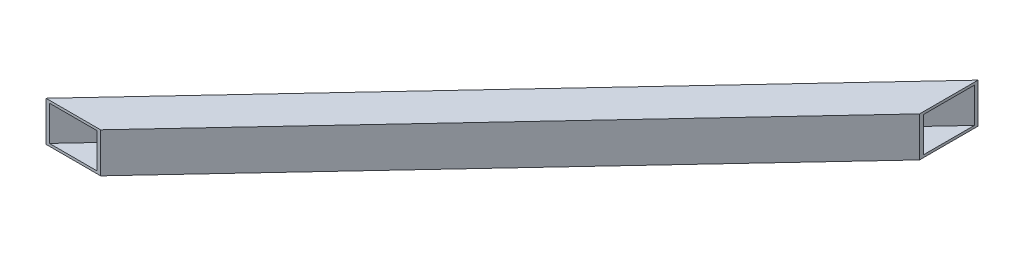
ISO-10303-21;
HEADER;
FILE_DESCRIPTION(('STEP AP214'),'2;1');
FILE_NAME('part.step','',(''),(''),'','','');
FILE_SCHEMA(('AUTOMOTIVE_DESIGN { 1 0 10303 214 1 1 1 1 }'));
ENDSEC;
DATA;
#1=APPLICATION_CONTEXT('core data for automotive mechanical design processes');
#2=APPLICATION_PROTOCOL_DEFINITION('international standard','automotive_design',2000,#1);
#3=PRODUCT_CONTEXT('',#1,'mechanical');
#4=PRODUCT('Part','Part','',(#3));
#5=PRODUCT_RELATED_PRODUCT_CATEGORY('part','',(#4));
#6=PRODUCT_DEFINITION_FORMATION('','',#4);
#7=PRODUCT_DEFINITION_CONTEXT('part definition',#1,'design');
#8=PRODUCT_DEFINITION('design','',#6,#7);
#9=PRODUCT_DEFINITION_SHAPE('','',#8);
#10=(LENGTH_UNIT() NAMED_UNIT(*) SI_UNIT(.MILLI.,.METRE.));
#11=(NAMED_UNIT(*) PLANE_ANGLE_UNIT() SI_UNIT($,.RADIAN.));
#12=(NAMED_UNIT(*) SI_UNIT($,.STERADIAN.) SOLID_ANGLE_UNIT());
#13=UNCERTAINTY_MEASURE_WITH_UNIT(LENGTH_MEASURE(1.E-05),#10,'distance_accuracy_value','');
#14=(GEOMETRIC_REPRESENTATION_CONTEXT(3) GLOBAL_UNCERTAINTY_ASSIGNED_CONTEXT((#13)) GLOBAL_UNIT_ASSIGNED_CONTEXT((#10,
#11,#12)) REPRESENTATION_CONTEXT('',''));
#15=CARTESIAN_POINT('',(0.,0.,0.));
#16=DIRECTION('',(0.,0.,1.));
#17=DIRECTION('',(1.,0.,0.));
#18=AXIS2_PLACEMENT_3D('',#15,#16,#17);
#19=CARTESIAN_POINT('',(100.980733230179,9.525,-121.974099335157));
#20=DIRECTION('',(0.730526939324927,0.,0.682883878064605));
#21=DIRECTION('',(0.682883878064605,0.,-0.730526939324927));
#22=AXIS2_PLACEMENT_3D('',#19,#20,#21);
#23=PLANE('',#22);
#24=DIRECTION('',(-0.682883878064605,0.,0.730526939324927));
#25=VECTOR('',#24,1.);
#26=CARTESIAN_POINT('',(100.980733230179,-9.525,-121.974099335157));
#27=LINE('',#26,#25);
#28=CARTESIAN_POINT('',(100.980733230179,-9.525,-121.974099335157));
#29=VERTEX_POINT('',#28);
#30=CARTESIAN_POINT('',(-114.019266769821,-9.525,108.025900664843));
#31=VERTEX_POINT('',#30);
#32=EDGE_CURVE('E148',#29,#31,#27,.T.);
#33=ORIENTED_EDGE('',*,*,#32,.T.);
#34=DIRECTION('',(0.,-1.,0.));
#35=VECTOR('',#34,1.);
#36=CARTESIAN_POINT('',(-114.019266769821,9.525,108.025900664843));
#37=LINE('',#36,#35);
#38=CARTESIAN_POINT('',(-114.019266769821,9.525,108.025900664843));
#39=VERTEX_POINT('',#38);
#40=EDGE_CURVE('E11',#39,#31,#37,.T.);
#41=ORIENTED_EDGE('',*,*,#40,.F.);
#42=DIRECTION('',(-0.682883878064605,0.,0.730526939324927));
#43=VECTOR('',#42,1.);
#44=CARTESIAN_POINT('',(100.980733230179,9.525,-121.974099335157));
#45=LINE('',#44,#43);
#46=CARTESIAN_POINT('',(100.980733230179,9.525,-121.974099335157));
#47=VERTEX_POINT('',#46);
#48=EDGE_CURVE('E155',#47,#39,#45,.T.);
#49=ORIENTED_EDGE('',*,*,#48,.F.);
#50=DIRECTION('',(0.,-1.,0.));
#51=VECTOR('',#50,1.);
#52=CARTESIAN_POINT('',(100.980733230179,9.525,-121.974099335157));
#53=LINE('',#52,#51);
#54=EDGE_CURVE('E169',#47,#29,#53,.T.);
#55=ORIENTED_EDGE('',*,*,#54,.T.);
#56=EDGE_LOOP('',(#33,#41,#49,#55));
#57=FACE_BOUND('',#56,.T.);
#58=ADVANCED_FACE('F39',(#57),#23,.F.);
#59=CARTESIAN_POINT('',(-114.019266769821,9.525,108.025900664843));
#60=DIRECTION('',(0.,0.,-1.));
#61=DIRECTION('',(-1.,0.,0.));
#62=AXIS2_PLACEMENT_3D('',#59,#60,#61);
#63=PLANE('',#62);
#64=DIRECTION('',(0.,1.,0.));
#65=VECTOR('',#64,1.);
#66=CARTESIAN_POINT('',(-89.5848495852952,-8.325,108.025900664843));
#67=LINE('',#66,#65);
#68=CARTESIAN_POINT('',(-89.5848495852952,-8.325,108.025900664843));
#69=VERTEX_POINT('',#68);
#70=CARTESIAN_POINT('',(-89.5848495852952,8.325,108.025900664843));
#71=VERTEX_POINT('',#70);
#72=EDGE_CURVE('E145',#69,#71,#67,.T.);
#73=ORIENTED_EDGE('',*,*,#72,.F.);
#74=DIRECTION('',(1.,0.,0.));
#75=VECTOR('',#74,1.);
#76=CARTESIAN_POINT('',(-112.376616875063,-8.325,108.025900664843));
#77=LINE('',#76,#75);
#78=CARTESIAN_POINT('',(-112.376616875063,-8.325,108.025900664843));
#79=VERTEX_POINT('',#78);
#80=EDGE_CURVE('E112',#79,#69,#77,.T.);
#81=ORIENTED_EDGE('',*,*,#80,.F.);
#82=DIRECTION('',(0.,1.,0.));
#83=VECTOR('',#82,1.);
#84=CARTESIAN_POINT('',(-112.376616875063,-8.325,108.025900664843));
#85=LINE('',#84,#83);
#86=CARTESIAN_POINT('',(-112.376616875063,8.325,108.025900664843));
#87=VERTEX_POINT('',#86);
#88=EDGE_CURVE('E149',#79,#87,#85,.T.);
#89=ORIENTED_EDGE('',*,*,#88,.T.);
#90=DIRECTION('',(1.,0.,0.));
#91=VECTOR('',#90,1.);
#92=CARTESIAN_POINT('',(-112.376616875063,8.325,108.025900664843));
#93=LINE('',#92,#91);
#94=EDGE_CURVE('E123',#87,#71,#93,.T.);
#95=ORIENTED_EDGE('',*,*,#94,.T.);
#96=EDGE_LOOP('',(#73,#81,#89,#95));
#97=FACE_BOUND('',#96,.T.);
#98=DIRECTION('',(1.,0.,0.));
#99=VECTOR('',#98,1.);
#100=CARTESIAN_POINT('',(-114.019266769821,-9.525,108.025900664843));
#101=LINE('',#100,#99);
#102=CARTESIAN_POINT('',(-87.9421996905372,-9.525,108.025900664843));
#103=VERTEX_POINT('',#102);
#104=EDGE_CURVE('E173',#31,#103,#101,.T.);
#105=ORIENTED_EDGE('',*,*,#104,.T.);
#106=DIRECTION('',(0.,-1.,0.));
#107=VECTOR('',#106,1.);
#108=CARTESIAN_POINT('',(-87.9421996905372,9.525,108.025900664843));
#109=LINE('',#108,#107);
#110=CARTESIAN_POINT('',(-87.9421996905372,9.525,108.025900664843));
#111=VERTEX_POINT('',#110);
#112=EDGE_CURVE('E47',#111,#103,#109,.T.);
#113=ORIENTED_EDGE('',*,*,#112,.F.);
#114=DIRECTION('',(1.,0.,0.));
#115=VECTOR('',#114,1.);
#116=CARTESIAN_POINT('',(-114.019266769821,9.525,108.025900664843));
#117=LINE('',#116,#115);
#118=EDGE_CURVE('E159',#39,#111,#117,.T.);
#119=ORIENTED_EDGE('',*,*,#118,.F.);
#120=ORIENTED_EDGE('',*,*,#40,.T.);
#121=EDGE_LOOP('',(#105,#113,#119,#120));
#122=FACE_BOUND('',#121,.T.);
#123=ADVANCED_FACE('F207',(#97,#122),#63,.F.);
#124=CARTESIAN_POINT('',(-87.9421996905372,9.525,108.025900664843));
#125=DIRECTION('',(-0.730526939324927,0.,-0.682883878064605));
#126=DIRECTION('',(-0.682883878064605,0.,0.730526939324927));
#127=AXIS2_PLACEMENT_3D('',#124,#125,#126);
#128=PLANE('',#127);
#129=DIRECTION('',(0.682883878064605,0.,-0.730526939324927));
#130=VECTOR('',#129,1.);
#131=CARTESIAN_POINT('',(-87.9421996905372,-9.525,108.025900664843));
#132=LINE('',#131,#130);
#133=CARTESIAN_POINT('',(100.980733230179,-9.525,-94.0777019945282));
#134=VERTEX_POINT('',#133);
#135=EDGE_CURVE('E176',#103,#134,#132,.T.);
#136=ORIENTED_EDGE('',*,*,#135,.T.);
#137=DIRECTION('',(0.,-1.,0.));
#138=VECTOR('',#137,1.);
#139=CARTESIAN_POINT('',(100.980733230179,9.525,-94.0777019945282));
#140=LINE('',#139,#138);
#141=CARTESIAN_POINT('',(100.980733230179,9.525,-94.0777019945282));
#142=VERTEX_POINT('',#141);
#143=EDGE_CURVE('E184',#142,#134,#140,.T.);
#144=ORIENTED_EDGE('',*,*,#143,.F.);
#145=DIRECTION('',(0.682883878064605,0.,-0.730526939324927));
#146=VECTOR('',#145,1.);
#147=CARTESIAN_POINT('',(-87.9421996905372,9.525,108.025900664843));
#148=LINE('',#147,#146);
#149=EDGE_CURVE('E163',#111,#142,#148,.T.);
#150=ORIENTED_EDGE('',*,*,#149,.F.);
#151=ORIENTED_EDGE('',*,*,#112,.T.);
#152=EDGE_LOOP('',(#136,#144,#150,#151));
#153=FACE_BOUND('',#152,.T.);
#154=ADVANCED_FACE('F193',(#153),#128,.F.);
#155=CARTESIAN_POINT('',(100.980733230179,9.525,-94.0777019945282));
#156=DIRECTION('',(-1.,0.,0.));
#157=DIRECTION('',(0.,0.,1.));
#158=AXIS2_PLACEMENT_3D('',#155,#156,#157);
#159=PLANE('',#158);
#160=DIRECTION('',(0.,1.,0.));
#161=VECTOR('',#160,1.);
#162=CARTESIAN_POINT('',(100.980733230179,-8.325,-120.21684595937));
#163=LINE('',#162,#161);
#164=CARTESIAN_POINT('',(100.980733230179,-8.325,-120.21684595937));
#165=VERTEX_POINT('',#164);
#166=CARTESIAN_POINT('',(100.980733230179,8.325,-120.21684595937));
#167=VERTEX_POINT('',#166);
#168=EDGE_CURVE('E111',#165,#167,#163,.T.);
#169=ORIENTED_EDGE('',*,*,#168,.F.);
#170=DIRECTION('',(0.,0.,-1.));
#171=VECTOR('',#170,1.);
#172=CARTESIAN_POINT('',(100.980733230179,-8.325,-95.8349553703159));
#173=LINE('',#172,#171);
#174=CARTESIAN_POINT('',(100.980733230179,-8.325,-95.8349553703159));
#175=VERTEX_POINT('',#174);
#176=EDGE_CURVE('E118',#175,#165,#173,.T.);
#177=ORIENTED_EDGE('',*,*,#176,.F.);
#178=DIRECTION('',(0.,1.,0.));
#179=VECTOR('',#178,1.);
#180=CARTESIAN_POINT('',(100.980733230179,-8.325,-95.8349553703159));
#181=LINE('',#180,#179);
#182=CARTESIAN_POINT('',(100.980733230179,8.325,-95.8349553703159));
#183=VERTEX_POINT('',#182);
#184=EDGE_CURVE('E102',#175,#183,#181,.T.);
#185=ORIENTED_EDGE('',*,*,#184,.T.);
#186=DIRECTION('',(0.,0.,-1.));
#187=VECTOR('',#186,1.);
#188=CARTESIAN_POINT('',(100.980733230179,8.325,-95.8349553703159));
#189=LINE('',#188,#187);
#190=EDGE_CURVE('E137',#183,#167,#189,.T.);
#191=ORIENTED_EDGE('',*,*,#190,.T.);
#192=EDGE_LOOP('',(#169,#177,#185,#191));
#193=FACE_BOUND('',#192,.T.);
#194=DIRECTION('',(0.,0.,-1.));
#195=VECTOR('',#194,1.);
#196=CARTESIAN_POINT('',(100.980733230179,-9.525,-94.0777019945282));
#197=LINE('',#196,#195);
#198=EDGE_CURVE('E160',#134,#29,#197,.T.);
#199=ORIENTED_EDGE('',*,*,#198,.T.);
#200=ORIENTED_EDGE('',*,*,#54,.F.);
#201=DIRECTION('',(0.,0.,-1.));
#202=VECTOR('',#201,1.);
#203=CARTESIAN_POINT('',(100.980733230179,9.525,-94.0777019945282));
#204=LINE('',#203,#202);
#205=EDGE_CURVE('E166',#142,#47,#204,.T.);
#206=ORIENTED_EDGE('',*,*,#205,.F.);
#207=ORIENTED_EDGE('',*,*,#143,.T.);
#208=EDGE_LOOP('',(#199,#200,#206,#207));
#209=FACE_BOUND('',#208,.T.);
#210=ADVANCED_FACE('F125',(#193,#209),#159,.F.);
#211=CARTESIAN_POINT('',(0.,9.525,0.));
#212=DIRECTION('',(0.,1.,0.));
#213=DIRECTION('',(0.,0.,1.));
#214=AXIS2_PLACEMENT_3D('',#211,#212,#213);
#215=PLANE('',#214);
#216=ORIENTED_EDGE('',*,*,#48,.T.);
#217=ORIENTED_EDGE('',*,*,#118,.T.);
#218=ORIENTED_EDGE('',*,*,#149,.T.);
#219=ORIENTED_EDGE('',*,*,#205,.T.);
#220=EDGE_LOOP('',(#216,#217,#218,#219));
#221=FACE_BOUND('',#220,.T.);
#222=ADVANCED_FACE('F206',(#221),#215,.T.);
#223=CARTESIAN_POINT('',(0.,-9.525,0.));
#224=DIRECTION('',(0.,1.,0.));
#225=DIRECTION('',(0.,0.,1.));
#226=AXIS2_PLACEMENT_3D('',#223,#224,#225);
#227=PLANE('',#226);
#228=ORIENTED_EDGE('',*,*,#32,.F.);
#229=ORIENTED_EDGE('',*,*,#198,.F.);
#230=ORIENTED_EDGE('',*,*,#135,.F.);
#231=ORIENTED_EDGE('',*,*,#104,.F.);
#232=EDGE_LOOP('',(#228,#229,#230,#231));
#233=FACE_BOUND('',#232,.T.);
#234=ADVANCED_FACE('F199',(#233),#227,.F.);
#235=CARTESIAN_POINT('',(-89.5848495852952,-8.325,108.025900664843));
#236=DIRECTION('',(0.730526939324927,0.,0.682883878064605));
#237=DIRECTION('',(0.682883878064605,0.,-0.730526939324927));
#238=AXIS2_PLACEMENT_3D('',#235,#236,#237);
#239=PLANE('',#238);
#240=DIRECTION('',(0.682883878064605,0.,-0.730526939324927));
#241=VECTOR('',#240,1.);
#242=CARTESIAN_POINT('',(-89.5848495852952,8.325,108.025900664843));
#243=LINE('',#242,#241);
#244=EDGE_CURVE('E54',#71,#183,#243,.T.);
#245=ORIENTED_EDGE('',*,*,#244,.T.);
#246=ORIENTED_EDGE('',*,*,#184,.F.);
#247=DIRECTION('',(0.682883878064605,0.,-0.730526939324927));
#248=VECTOR('',#247,1.);
#249=CARTESIAN_POINT('',(-89.5848495852952,-8.325,108.025900664843));
#250=LINE('',#249,#248);
#251=EDGE_CURVE('E105',#69,#175,#250,.T.);
#252=ORIENTED_EDGE('',*,*,#251,.F.);
#253=ORIENTED_EDGE('',*,*,#72,.T.);
#254=EDGE_LOOP('',(#245,#246,#252,#253));
#255=FACE_BOUND('',#254,.T.);
#256=ADVANCED_FACE('F104',(#255),#239,.F.);
#257=CARTESIAN_POINT('',(100.980733230179,-8.325,-120.21684595937));
#258=DIRECTION('',(-0.730526939324927,0.,-0.682883878064605));
#259=DIRECTION('',(-0.682883878064605,0.,0.730526939324927));
#260=AXIS2_PLACEMENT_3D('',#257,#258,#259);
#261=PLANE('',#260);
#262=DIRECTION('',(-0.682883878064605,0.,0.730526939324927));
#263=VECTOR('',#262,1.);
#264=CARTESIAN_POINT('',(100.980733230179,8.325,-120.21684595937));
#265=LINE('',#264,#263);
#266=EDGE_CURVE('E59',#167,#87,#265,.T.);
#267=ORIENTED_EDGE('',*,*,#266,.T.);
#268=ORIENTED_EDGE('',*,*,#88,.F.);
#269=DIRECTION('',(-0.682883878064605,0.,0.730526939324927));
#270=VECTOR('',#269,1.);
#271=CARTESIAN_POINT('',(100.980733230179,-8.325,-120.21684595937));
#272=LINE('',#271,#270);
#273=EDGE_CURVE('E128',#165,#79,#272,.T.);
#274=ORIENTED_EDGE('',*,*,#273,.F.);
#275=ORIENTED_EDGE('',*,*,#168,.T.);
#276=EDGE_LOOP('',(#267,#268,#274,#275));
#277=FACE_BOUND('',#276,.T.);
#278=ADVANCED_FACE('F224',(#277),#261,.F.);
#279=CARTESIAN_POINT('',(0.,-8.325,0.));
#280=DIRECTION('',(0.,-1.,0.));
#281=DIRECTION('',(0.,0.,-1.));
#282=AXIS2_PLACEMENT_3D('',#279,#280,#281);
#283=PLANE('',#282);
#284=ORIENTED_EDGE('',*,*,#251,.T.);
#285=ORIENTED_EDGE('',*,*,#176,.T.);
#286=ORIENTED_EDGE('',*,*,#273,.T.);
#287=ORIENTED_EDGE('',*,*,#80,.T.);
#288=EDGE_LOOP('',(#284,#285,#286,#287));
#289=FACE_BOUND('',#288,.T.);
#290=ADVANCED_FACE('F116',(#289),#283,.F.);
#291=CARTESIAN_POINT('',(0.,8.325,0.));
#292=DIRECTION('',(0.,-1.,0.));
#293=DIRECTION('',(0.,0.,-1.));
#294=AXIS2_PLACEMENT_3D('',#291,#292,#293);
#295=PLANE('',#294);
#296=ORIENTED_EDGE('',*,*,#244,.F.);
#297=ORIENTED_EDGE('',*,*,#94,.F.);
#298=ORIENTED_EDGE('',*,*,#266,.F.);
#299=ORIENTED_EDGE('',*,*,#190,.F.);
#300=EDGE_LOOP('',(#296,#297,#298,#299));
#301=FACE_BOUND('',#300,.T.);
#302=ADVANCED_FACE('F228',(#301),#295,.T.);
#303=CLOSED_SHELL('',(#58,#123,#154,#210,#222,#234,#256,#278,#290,#302));
#304=MANIFOLD_SOLID_BREP('B2',#303);
#305=ADVANCED_BREP_SHAPE_REPRESENTATION('',(#18,#304),#14);
#306=SHAPE_DEFINITION_REPRESENTATION(#9,#305);
ENDSEC;
END-ISO-10303-21;
